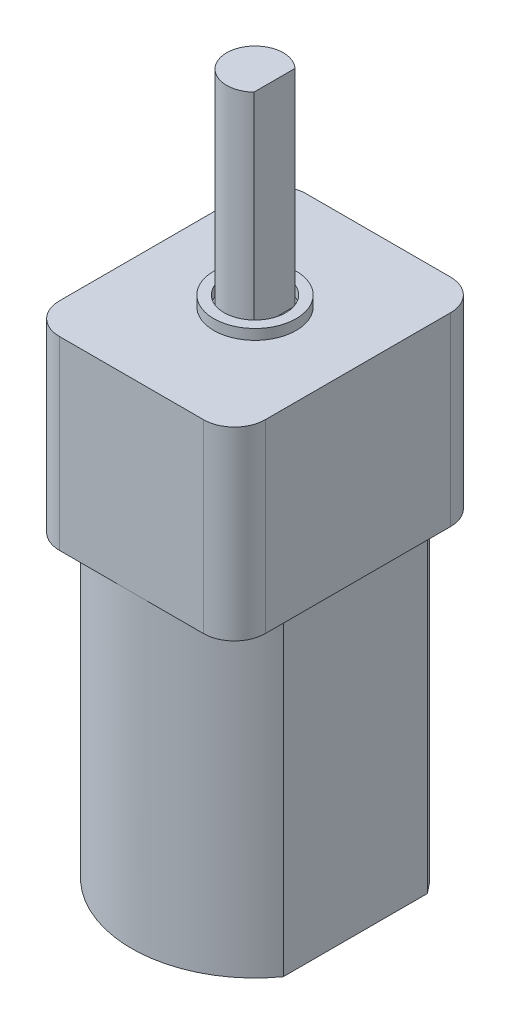
ISO-10303-21;
HEADER;
FILE_DESCRIPTION(('STEP AP214'),'2;1');
FILE_NAME('part.step','',(''),(''),'','','');
FILE_SCHEMA(('AUTOMOTIVE_DESIGN { 1 0 10303 214 1 1 1 1 }'));
ENDSEC;
DATA;
#1=APPLICATION_CONTEXT('core data for automotive mechanical design processes');
#2=APPLICATION_PROTOCOL_DEFINITION('international standard','automotive_design',2000,#1);
#3=PRODUCT_CONTEXT('',#1,'mechanical');
#4=PRODUCT('Part','Part','',(#3));
#5=PRODUCT_RELATED_PRODUCT_CATEGORY('part','',(#4));
#6=PRODUCT_DEFINITION_FORMATION('','',#4);
#7=PRODUCT_DEFINITION_CONTEXT('part definition',#1,'design');
#8=PRODUCT_DEFINITION('design','',#6,#7);
#9=PRODUCT_DEFINITION_SHAPE('','',#8);
#10=(LENGTH_UNIT() NAMED_UNIT(*) SI_UNIT(.MILLI.,.METRE.));
#11=(NAMED_UNIT(*) PLANE_ANGLE_UNIT() SI_UNIT($,.RADIAN.));
#12=(NAMED_UNIT(*) SI_UNIT($,.STERADIAN.) SOLID_ANGLE_UNIT());
#13=UNCERTAINTY_MEASURE_WITH_UNIT(LENGTH_MEASURE(1.E-05),#10,'distance_accuracy_value','');
#14=(GEOMETRIC_REPRESENTATION_CONTEXT(3) GLOBAL_UNCERTAINTY_ASSIGNED_CONTEXT((#13)) GLOBAL_UNIT_ASSIGNED_CONTEXT((#10,
#11,#12)) REPRESENTATION_CONTEXT('',''));
#15=CARTESIAN_POINT('',(0.,0.,0.));
#16=DIRECTION('',(0.,0.,1.));
#17=DIRECTION('',(1.,0.,0.));
#18=AXIS2_PLACEMENT_3D('',#15,#16,#17);
#19=CARTESIAN_POINT('',(0.,24.,0.));
#20=DIRECTION('',(0.,1.,0.));
#21=DIRECTION('',(0.,0.,1.));
#22=AXIS2_PLACEMENT_3D('',#19,#20,#21);
#23=PLANE('',#22);
#24=CARTESIAN_POINT('',(0.,24.,0.));
#25=DIRECTION('',(0.,1.,0.));
#26=DIRECTION('',(0.,0.,1.));
#27=AXIS2_PLACEMENT_3D('',#24,#25,#26);
#28=CIRCLE('',#27,1.5);
#29=CARTESIAN_POINT('',(0.,24.,1.5));
#30=VERTEX_POINT('',#29);
#31=EDGE_CURVE('E45',#30,#30,#28,.F.);
#32=ORIENTED_EDGE('',*,*,#31,.F.);
#33=EDGE_LOOP('',(#32));
#34=FACE_BOUND('',#33,.T.);
#35=DIRECTION('',(0.,0.,-1.));
#36=VECTOR('',#35,1.);
#37=CARTESIAN_POINT('',(0.943729304408844,24.,-1.));
#38=LINE('',#37,#36);
#39=CARTESIAN_POINT('',(0.943729304408844,24.,1.));
#40=VERTEX_POINT('',#39);
#41=CARTESIAN_POINT('',(0.943729304408844,24.,-1.));
#42=VERTEX_POINT('',#41);
#43=EDGE_CURVE('E165',#40,#42,#38,.T.);
#44=ORIENTED_EDGE('',*,*,#43,.F.);
#45=CARTESIAN_POINT('',(0.,24.,0.));
#46=DIRECTION('',(0.,1.,0.));
#47=DIRECTION('',(0.,0.,1.));
#48=AXIS2_PLACEMENT_3D('',#45,#46,#47);
#49=CIRCLE('',#48,1.375);
#50=EDGE_CURVE('E58',#42,#40,#49,.T.);
#51=ORIENTED_EDGE('',*,*,#50,.F.);
#52=EDGE_LOOP('',(#44,#51));
#53=FACE_BOUND('',#52,.T.);
#54=ADVANCED_FACE('F41',(#34,#53),#23,.T.);
#55=CARTESIAN_POINT('',(0.,15.,0.));
#56=DIRECTION('',(0.,-1.,0.));
#57=DIRECTION('',(0.,0.,-1.));
#58=AXIS2_PLACEMENT_3D('',#55,#56,#57);
#59=CYLINDRICAL_SURFACE('',#58,6.);
#60=CARTESIAN_POINT('',(0.,0.,0.));
#61=DIRECTION('',(0.,1.,0.));
#62=DIRECTION('',(0.,0.,1.));
#63=AXIS2_PLACEMENT_3D('',#60,#61,#62);
#64=CIRCLE('',#63,6.);
#65=CARTESIAN_POINT('',(-4.87339717240448,0.,3.5));
#66=VERTEX_POINT('',#65);
#67=CARTESIAN_POINT('',(4.87339717240448,0.,3.5));
#68=VERTEX_POINT('',#67);
#69=EDGE_CURVE('E204',#66,#68,#64,.T.);
#70=ORIENTED_EDGE('',*,*,#69,.T.);
#71=DIRECTION('',(0.,-1.,0.));
#72=VECTOR('',#71,1.);
#73=CARTESIAN_POINT('',(4.87339717240448,15.,3.5));
#74=LINE('',#73,#72);
#75=CARTESIAN_POINT('',(4.87339717240448,15.,3.5));
#76=VERTEX_POINT('',#75);
#77=EDGE_CURVE('E260',#76,#68,#74,.T.);
#78=ORIENTED_EDGE('',*,*,#77,.F.);
#79=CARTESIAN_POINT('',(0.,15.,0.));
#80=DIRECTION('',(0.,1.,0.));
#81=DIRECTION('',(0.,0.,1.));
#82=AXIS2_PLACEMENT_3D('',#79,#80,#81);
#83=CIRCLE('',#82,6.);
#84=CARTESIAN_POINT('',(0.,15.,6.));
#85=VERTEX_POINT('',#84);
#86=EDGE_CURVE('E223',#85,#76,#83,.T.);
#87=ORIENTED_EDGE('',*,*,#86,.F.);
#88=CARTESIAN_POINT('',(-4.87339717240448,15.,3.5));
#89=VERTEX_POINT('',#88);
#90=EDGE_CURVE('E218',#89,#85,#83,.T.);
#91=ORIENTED_EDGE('',*,*,#90,.F.);
#92=DIRECTION('',(0.,-1.,0.));
#93=VECTOR('',#92,1.);
#94=CARTESIAN_POINT('',(-4.87339717240448,15.,3.5));
#95=LINE('',#94,#93);
#96=EDGE_CURVE('E236',#89,#66,#95,.T.);
#97=ORIENTED_EDGE('',*,*,#96,.T.);
#98=EDGE_LOOP('',(#70,#78,#87,#91,#97));
#99=FACE_BOUND('',#98,.T.);
#100=ADVANCED_FACE('F323',(#99),#59,.T.);
#101=CARTESIAN_POINT('',(4.87339717240448,15.,3.5));
#102=DIRECTION('',(-1.,0.,0.));
#103=DIRECTION('',(0.,0.,1.));
#104=AXIS2_PLACEMENT_3D('',#101,#102,#103);
#105=PLANE('',#104);
#106=DIRECTION('',(0.,0.,-1.));
#107=VECTOR('',#106,1.);
#108=CARTESIAN_POINT('',(4.87339717240448,0.,3.5));
#109=LINE('',#108,#107);
#110=CARTESIAN_POINT('',(4.87339717240448,0.,-3.5));
#111=VERTEX_POINT('',#110);
#112=EDGE_CURVE('E240',#68,#111,#109,.T.);
#113=ORIENTED_EDGE('',*,*,#112,.T.);
#114=DIRECTION('',(0.,-1.,0.));
#115=VECTOR('',#114,1.);
#116=CARTESIAN_POINT('',(4.87339717240448,15.,-3.5));
#117=LINE('',#116,#115);
#118=CARTESIAN_POINT('',(4.87339717240448,15.,-3.5));
#119=VERTEX_POINT('',#118);
#120=EDGE_CURVE('E256',#119,#111,#117,.T.);
#121=ORIENTED_EDGE('',*,*,#120,.F.);
#122=DIRECTION('',(0.,0.,-1.));
#123=VECTOR('',#122,1.);
#124=CARTESIAN_POINT('',(4.87339717240448,15.,3.5));
#125=LINE('',#124,#123);
#126=EDGE_CURVE('E222',#76,#119,#125,.T.);
#127=ORIENTED_EDGE('',*,*,#126,.F.);
#128=ORIENTED_EDGE('',*,*,#77,.T.);
#129=EDGE_LOOP('',(#113,#121,#127,#128));
#130=FACE_BOUND('',#129,.T.);
#131=ADVANCED_FACE('F469',(#130),#105,.F.);
#132=CARTESIAN_POINT('',(0.,15.,0.));
#133=DIRECTION('',(0.,-1.,0.));
#134=DIRECTION('',(0.,0.,-1.));
#135=AXIS2_PLACEMENT_3D('',#132,#133,#134);
#136=CYLINDRICAL_SURFACE('',#135,6.);
#137=CARTESIAN_POINT('',(0.,0.,0.));
#138=DIRECTION('',(0.,1.,0.));
#139=DIRECTION('',(0.,0.,1.));
#140=AXIS2_PLACEMENT_3D('',#137,#138,#139);
#141=CIRCLE('',#140,6.);
#142=CARTESIAN_POINT('',(-4.87339717240448,0.,-3.5));
#143=VERTEX_POINT('',#142);
#144=EDGE_CURVE('E243',#111,#143,#141,.T.);
#145=ORIENTED_EDGE('',*,*,#144,.T.);
#146=DIRECTION('',(0.,-1.,0.));
#147=VECTOR('',#146,1.);
#148=CARTESIAN_POINT('',(-4.87339717240448,15.,-3.5));
#149=LINE('',#148,#147);
#150=CARTESIAN_POINT('',(-4.87339717240448,15.,-3.5));
#151=VERTEX_POINT('',#150);
#152=EDGE_CURVE('E252',#151,#143,#149,.T.);
#153=ORIENTED_EDGE('',*,*,#152,.F.);
#154=CARTESIAN_POINT('',(0.,15.,0.));
#155=DIRECTION('',(0.,1.,0.));
#156=DIRECTION('',(0.,0.,1.));
#157=AXIS2_PLACEMENT_3D('',#154,#155,#156);
#158=CIRCLE('',#157,6.);
#159=CARTESIAN_POINT('',(0.,15.,-6.));
#160=VERTEX_POINT('',#159);
#161=EDGE_CURVE('E227',#160,#151,#158,.T.);
#162=ORIENTED_EDGE('',*,*,#161,.F.);
#163=EDGE_CURVE('E228',#119,#160,#158,.T.);
#164=ORIENTED_EDGE('',*,*,#163,.F.);
#165=ORIENTED_EDGE('',*,*,#120,.T.);
#166=EDGE_LOOP('',(#145,#153,#162,#164,#165));
#167=FACE_BOUND('',#166,.T.);
#168=ADVANCED_FACE('F467',(#167),#136,.T.);
#169=CARTESIAN_POINT('',(-4.87339717240448,15.,3.5));
#170=DIRECTION('',(1.,0.,0.));
#171=DIRECTION('',(0.,0.,-1.));
#172=AXIS2_PLACEMENT_3D('',#169,#170,#171);
#173=PLANE('',#172);
#174=DIRECTION('',(0.,0.,1.));
#175=VECTOR('',#174,1.);
#176=CARTESIAN_POINT('',(-4.87339717240448,0.,3.5));
#177=LINE('',#176,#175);
#178=EDGE_CURVE('E246',#143,#66,#177,.T.);
#179=ORIENTED_EDGE('',*,*,#178,.T.);
#180=ORIENTED_EDGE('',*,*,#96,.F.);
#181=DIRECTION('',(0.,0.,1.));
#182=VECTOR('',#181,1.);
#183=CARTESIAN_POINT('',(-4.87339717240448,15.,3.5));
#184=LINE('',#183,#182);
#185=EDGE_CURVE('E232',#151,#89,#184,.T.);
#186=ORIENTED_EDGE('',*,*,#185,.F.);
#187=ORIENTED_EDGE('',*,*,#152,.T.);
#188=EDGE_LOOP('',(#179,#180,#186,#187));
#189=FACE_BOUND('',#188,.T.);
#190=ADVANCED_FACE('F367',(#189),#173,.F.);
#191=CARTESIAN_POINT('',(0.,0.,0.));
#192=DIRECTION('',(0.,1.,0.));
#193=DIRECTION('',(0.,0.,1.));
#194=AXIS2_PLACEMENT_3D('',#191,#192,#193);
#195=PLANE('',#194);
#196=CARTESIAN_POINT('',(0.,0.,0.));
#197=DIRECTION('',(0.,-1.,0.));
#198=DIRECTION('',(0.,0.,-1.));
#199=AXIS2_PLACEMENT_3D('',#196,#197,#198);
#200=CIRCLE('',#199,2.5);
#201=CARTESIAN_POINT('',(0.,0.,-2.5));
#202=VERTEX_POINT('',#201);
#203=EDGE_CURVE('E11',#202,#202,#200,.T.);
#204=ORIENTED_EDGE('',*,*,#203,.F.);
#205=EDGE_LOOP('',(#204));
#206=FACE_BOUND('',#205,.T.);
#207=ORIENTED_EDGE('',*,*,#69,.F.);
#208=ORIENTED_EDGE('',*,*,#178,.F.);
#209=ORIENTED_EDGE('',*,*,#144,.F.);
#210=ORIENTED_EDGE('',*,*,#112,.F.);
#211=EDGE_LOOP('',(#207,#208,#209,#210));
#212=FACE_BOUND('',#211,.T.);
#213=ADVANCED_FACE('F363',(#206,#212),#195,.F.);
#214=CARTESIAN_POINT('',(0.,15.,0.));
#215=DIRECTION('',(0.,1.,0.));
#216=DIRECTION('',(0.,0.,1.));
#217=AXIS2_PLACEMENT_3D('',#214,#215,#216);
#218=PLANE('',#217);
#219=DIRECTION('',(1.,0.,0.));
#220=VECTOR('',#219,1.);
#221=CARTESIAN_POINT('',(-5.,15.,6.));
#222=LINE('',#221,#220);
#223=CARTESIAN_POINT('',(-3.5,15.,6.));
#224=VERTEX_POINT('',#223);
#225=EDGE_CURVE('E209',#224,#85,#222,.T.);
#226=ORIENTED_EDGE('',*,*,#225,.F.);
#227=CARTESIAN_POINT('',(-3.5,15.,4.5));
#228=DIRECTION('',(0.,1.,0.));
#229=DIRECTION('',(0.,0.,1.));
#230=AXIS2_PLACEMENT_3D('',#227,#228,#229);
#231=CIRCLE('',#230,1.5);
#232=CARTESIAN_POINT('',(-5.,15.,4.5));
#233=VERTEX_POINT('',#232);
#234=EDGE_CURVE('E274',#224,#233,#231,.F.);
#235=ORIENTED_EDGE('',*,*,#234,.T.);
#236=DIRECTION('',(0.,0.,1.));
#237=VECTOR('',#236,1.);
#238=CARTESIAN_POINT('',(-5.,15.,-6.));
#239=LINE('',#238,#237);
#240=CARTESIAN_POINT('',(-5.,15.,-4.5));
#241=VERTEX_POINT('',#240);
#242=EDGE_CURVE('E183',#241,#233,#239,.T.);
#243=ORIENTED_EDGE('',*,*,#242,.F.);
#244=CARTESIAN_POINT('',(-3.5,15.,-4.5));
#245=DIRECTION('',(0.,1.,0.));
#246=DIRECTION('',(0.,0.,1.));
#247=AXIS2_PLACEMENT_3D('',#244,#245,#246);
#248=CIRCLE('',#247,1.5);
#249=CARTESIAN_POINT('',(-3.5,15.,-6.));
#250=VERTEX_POINT('',#249);
#251=EDGE_CURVE('E271',#241,#250,#248,.F.);
#252=ORIENTED_EDGE('',*,*,#251,.T.);
#253=DIRECTION('',(-1.,0.,0.));
#254=VECTOR('',#253,1.);
#255=CARTESIAN_POINT('',(-5.,15.,-6.));
#256=LINE('',#255,#254);
#257=EDGE_CURVE('E215',#160,#250,#256,.T.);
#258=ORIENTED_EDGE('',*,*,#257,.F.);
#259=ORIENTED_EDGE('',*,*,#161,.T.);
#260=ORIENTED_EDGE('',*,*,#185,.T.);
#261=ORIENTED_EDGE('',*,*,#90,.T.);
#262=EDGE_LOOP('',(#226,#235,#243,#252,#258,#259,#260,#261));
#263=FACE_BOUND('',#262,.T.);
#264=ADVANCED_FACE('F366',(#263),#218,.F.);
#265=DIRECTION('',(0.,0.,-1.));
#266=VECTOR('',#265,1.);
#267=CARTESIAN_POINT('',(5.,15.,-6.));
#268=LINE('',#267,#266);
#269=CARTESIAN_POINT('',(5.,15.,4.5));
#270=VERTEX_POINT('',#269);
#271=CARTESIAN_POINT('',(5.,15.,-4.5));
#272=VERTEX_POINT('',#271);
#273=EDGE_CURVE('E212',#270,#272,#268,.T.);
#274=ORIENTED_EDGE('',*,*,#273,.F.);
#275=CARTESIAN_POINT('',(3.5,15.,4.5));
#276=DIRECTION('',(0.,1.,0.));
#277=DIRECTION('',(0.,0.,1.));
#278=AXIS2_PLACEMENT_3D('',#275,#276,#277);
#279=CIRCLE('',#278,1.5);
#280=CARTESIAN_POINT('',(3.5,15.,6.));
#281=VERTEX_POINT('',#280);
#282=EDGE_CURVE('E311',#270,#281,#279,.F.);
#283=ORIENTED_EDGE('',*,*,#282,.T.);
#284=EDGE_CURVE('E208',#85,#281,#222,.T.);
#285=ORIENTED_EDGE('',*,*,#284,.F.);
#286=ORIENTED_EDGE('',*,*,#86,.T.);
#287=ORIENTED_EDGE('',*,*,#126,.T.);
#288=ORIENTED_EDGE('',*,*,#163,.T.);
#289=CARTESIAN_POINT('',(3.5,15.,-6.));
#290=VERTEX_POINT('',#289);
#291=EDGE_CURVE('E192',#290,#160,#256,.T.);
#292=ORIENTED_EDGE('',*,*,#291,.F.);
#293=CARTESIAN_POINT('',(3.5,15.,-4.5));
#294=DIRECTION('',(0.,1.,0.));
#295=DIRECTION('',(0.,0.,1.));
#296=AXIS2_PLACEMENT_3D('',#293,#294,#295);
#297=CIRCLE('',#296,1.5);
#298=EDGE_CURVE('E66',#290,#272,#297,.F.);
#299=ORIENTED_EDGE('',*,*,#298,.T.);
#300=EDGE_LOOP('',(#274,#283,#285,#286,#287,#288,#292,#299));
#301=FACE_BOUND('',#300,.T.);
#302=ADVANCED_FACE('F456',(#301),#218,.F.);
#303=CARTESIAN_POINT('',(-5.,24.,-6.));
#304=DIRECTION('',(1.,0.,0.));
#305=DIRECTION('',(0.,0.,-1.));
#306=AXIS2_PLACEMENT_3D('',#303,#304,#305);
#307=PLANE('',#306);
#308=ORIENTED_EDGE('',*,*,#242,.T.);
#309=DIRECTION('',(0.,-1.,0.));
#310=VECTOR('',#309,1.);
#311=CARTESIAN_POINT('',(-5.,24.,4.5));
#312=LINE('',#311,#310);
#313=CARTESIAN_POINT('',(-5.,24.,4.5));
#314=VERTEX_POINT('',#313);
#315=EDGE_CURVE('E281',#233,#314,#312,.F.);
#316=ORIENTED_EDGE('',*,*,#315,.T.);
#317=DIRECTION('',(0.,0.,1.));
#318=VECTOR('',#317,1.);
#319=CARTESIAN_POINT('',(-5.,24.,-6.));
#320=LINE('',#319,#318);
#321=CARTESIAN_POINT('',(-5.,24.,-4.5));
#322=VERTEX_POINT('',#321);
#323=EDGE_CURVE('E187',#322,#314,#320,.T.);
#324=ORIENTED_EDGE('',*,*,#323,.F.);
#325=DIRECTION('',(0.,-1.,0.));
#326=VECTOR('',#325,1.);
#327=CARTESIAN_POINT('',(-5.,24.,-4.5));
#328=LINE('',#327,#326);
#329=EDGE_CURVE('E277',#322,#241,#328,.T.);
#330=ORIENTED_EDGE('',*,*,#329,.T.);
#331=EDGE_LOOP('',(#308,#316,#324,#330));
#332=FACE_BOUND('',#331,.T.);
#333=ADVANCED_FACE('F418',(#332),#307,.F.);
#334=CARTESIAN_POINT('',(-5.,24.,6.));
#335=DIRECTION('',(0.,0.,-1.));
#336=DIRECTION('',(-1.,0.,0.));
#337=AXIS2_PLACEMENT_3D('',#334,#335,#336);
#338=PLANE('',#337);
#339=DIRECTION('',(1.,0.,0.));
#340=VECTOR('',#339,1.);
#341=CARTESIAN_POINT('',(-5.,24.,6.));
#342=LINE('',#341,#340);
#343=CARTESIAN_POINT('',(-3.5,24.,6.));
#344=VERTEX_POINT('',#343);
#345=CARTESIAN_POINT('',(3.5,24.,6.));
#346=VERTEX_POINT('',#345);
#347=EDGE_CURVE('E191',#344,#346,#342,.T.);
#348=ORIENTED_EDGE('',*,*,#347,.F.);
#349=DIRECTION('',(0.,-1.,0.));
#350=VECTOR('',#349,1.);
#351=CARTESIAN_POINT('',(-3.5,24.,6.));
#352=LINE('',#351,#350);
#353=EDGE_CURVE('E267',#344,#224,#352,.T.);
#354=ORIENTED_EDGE('',*,*,#353,.T.);
#355=ORIENTED_EDGE('',*,*,#225,.T.);
#356=ORIENTED_EDGE('',*,*,#284,.T.);
#357=DIRECTION('',(0.,-1.,0.));
#358=VECTOR('',#357,1.);
#359=CARTESIAN_POINT('',(3.5,24.,6.));
#360=LINE('',#359,#358);
#361=EDGE_CURVE('E264',#281,#346,#360,.F.);
#362=ORIENTED_EDGE('',*,*,#361,.T.);
#363=EDGE_LOOP('',(#348,#354,#355,#356,#362));
#364=FACE_BOUND('',#363,.T.);
#365=ADVANCED_FACE('F394',(#364),#338,.F.);
#366=CARTESIAN_POINT('',(5.,24.,-6.));
#367=DIRECTION('',(-1.,0.,0.));
#368=DIRECTION('',(0.,0.,1.));
#369=AXIS2_PLACEMENT_3D('',#366,#367,#368);
#370=PLANE('',#369);
#371=DIRECTION('',(0.,0.,-1.));
#372=VECTOR('',#371,1.);
#373=CARTESIAN_POINT('',(5.,24.,-6.));
#374=LINE('',#373,#372);
#375=CARTESIAN_POINT('',(5.,24.,4.5));
#376=VERTEX_POINT('',#375);
#377=CARTESIAN_POINT('',(5.,24.,-4.5));
#378=VERTEX_POINT('',#377);
#379=EDGE_CURVE('E196',#376,#378,#374,.T.);
#380=ORIENTED_EDGE('',*,*,#379,.F.);
#381=DIRECTION('',(0.,-1.,0.));
#382=VECTOR('',#381,1.);
#383=CARTESIAN_POINT('',(5.,24.,4.5));
#384=LINE('',#383,#382);
#385=EDGE_CURVE('E306',#376,#270,#384,.T.);
#386=ORIENTED_EDGE('',*,*,#385,.T.);
#387=ORIENTED_EDGE('',*,*,#273,.T.);
#388=DIRECTION('',(0.,-1.,0.));
#389=VECTOR('',#388,1.);
#390=CARTESIAN_POINT('',(5.,24.,-4.5));
#391=LINE('',#390,#389);
#392=EDGE_CURVE('E303',#272,#378,#391,.F.);
#393=ORIENTED_EDGE('',*,*,#392,.T.);
#394=EDGE_LOOP('',(#380,#386,#387,#393));
#395=FACE_BOUND('',#394,.T.);
#396=ADVANCED_FACE('F403',(#395),#370,.F.);
#397=CARTESIAN_POINT('',(-5.,24.,-6.));
#398=DIRECTION('',(0.,0.,1.));
#399=DIRECTION('',(1.,0.,0.));
#400=AXIS2_PLACEMENT_3D('',#397,#398,#399);
#401=PLANE('',#400);
#402=ORIENTED_EDGE('',*,*,#257,.T.);
#403=DIRECTION('',(0.,-1.,0.));
#404=VECTOR('',#403,1.);
#405=CARTESIAN_POINT('',(-3.5,24.,-6.));
#406=LINE('',#405,#404);
#407=CARTESIAN_POINT('',(-3.5,24.,-6.));
#408=VERTEX_POINT('',#407);
#409=EDGE_CURVE('E300',#250,#408,#406,.F.);
#410=ORIENTED_EDGE('',*,*,#409,.T.);
#411=DIRECTION('',(-1.,0.,0.));
#412=VECTOR('',#411,1.);
#413=CARTESIAN_POINT('',(-5.,24.,-6.));
#414=LINE('',#413,#412);
#415=CARTESIAN_POINT('',(3.5,24.,-6.));
#416=VERTEX_POINT('',#415);
#417=EDGE_CURVE('E200',#416,#408,#414,.T.);
#418=ORIENTED_EDGE('',*,*,#417,.F.);
#419=DIRECTION('',(0.,-1.,0.));
#420=VECTOR('',#419,1.);
#421=CARTESIAN_POINT('',(3.5,24.,-6.));
#422=LINE('',#421,#420);
#423=EDGE_CURVE('E296',#416,#290,#422,.T.);
#424=ORIENTED_EDGE('',*,*,#423,.T.);
#425=ORIENTED_EDGE('',*,*,#291,.T.);
#426=EDGE_LOOP('',(#402,#410,#418,#424,#425));
#427=FACE_BOUND('',#426,.T.);
#428=ADVANCED_FACE('F410',(#427),#401,.F.);
#429=CARTESIAN_POINT('',(0.,24.,0.));
#430=DIRECTION('',(0.,1.,0.));
#431=DIRECTION('',(0.,0.,1.));
#432=AXIS2_PLACEMENT_3D('',#429,#430,#431);
#433=CIRCLE('',#432,2.);
#434=CARTESIAN_POINT('',(0.,24.,2.));
#435=VERTEX_POINT('',#434);
#436=EDGE_CURVE('E174',#435,#435,#433,.T.);
#437=ORIENTED_EDGE('',*,*,#436,.F.);
#438=EDGE_LOOP('',(#437));
#439=FACE_BOUND('',#438,.T.);
#440=ORIENTED_EDGE('',*,*,#323,.T.);
#441=CARTESIAN_POINT('',(-3.5,24.,4.5));
#442=DIRECTION('',(0.,1.,0.));
#443=DIRECTION('',(0.,0.,1.));
#444=AXIS2_PLACEMENT_3D('',#441,#442,#443);
#445=CIRCLE('',#444,1.5);
#446=EDGE_CURVE('E293',#314,#344,#445,.T.);
#447=ORIENTED_EDGE('',*,*,#446,.T.);
#448=ORIENTED_EDGE('',*,*,#347,.T.);
#449=CARTESIAN_POINT('',(3.5,24.,4.5));
#450=DIRECTION('',(0.,1.,0.));
#451=DIRECTION('',(0.,0.,1.));
#452=AXIS2_PLACEMENT_3D('',#449,#450,#451);
#453=CIRCLE('',#452,1.5);
#454=EDGE_CURVE('E287',#346,#376,#453,.T.);
#455=ORIENTED_EDGE('',*,*,#454,.T.);
#456=ORIENTED_EDGE('',*,*,#379,.T.);
#457=CARTESIAN_POINT('',(3.5,24.,-4.5));
#458=DIRECTION('',(0.,1.,0.));
#459=DIRECTION('',(0.,0.,1.));
#460=AXIS2_PLACEMENT_3D('',#457,#458,#459);
#461=CIRCLE('',#460,1.5);
#462=EDGE_CURVE('E284',#378,#416,#461,.T.);
#463=ORIENTED_EDGE('',*,*,#462,.T.);
#464=ORIENTED_EDGE('',*,*,#417,.T.);
#465=CARTESIAN_POINT('',(-3.5,24.,-4.5));
#466=DIRECTION('',(0.,1.,0.));
#467=DIRECTION('',(0.,0.,1.));
#468=AXIS2_PLACEMENT_3D('',#465,#466,#467);
#469=CIRCLE('',#468,1.5);
#470=EDGE_CURVE('E290',#408,#322,#469,.T.);
#471=ORIENTED_EDGE('',*,*,#470,.T.);
#472=EDGE_LOOP('',(#440,#447,#448,#455,#456,#463,#464,#471));
#473=FACE_BOUND('',#472,.T.);
#474=ADVANCED_FACE('F325',(#439,#473),#23,.T.);
#475=CARTESIAN_POINT('',(-3.5,24.,4.5));
#476=DIRECTION('',(0.,-1.,0.));
#477=DIRECTION('',(0.,0.,-1.));
#478=AXIS2_PLACEMENT_3D('',#475,#476,#477);
#479=CYLINDRICAL_SURFACE('',#478,1.5);
#480=ORIENTED_EDGE('',*,*,#446,.F.);
#481=ORIENTED_EDGE('',*,*,#315,.F.);
#482=ORIENTED_EDGE('',*,*,#234,.F.);
#483=ORIENTED_EDGE('',*,*,#353,.F.);
#484=EDGE_LOOP('',(#480,#481,#482,#483));
#485=FACE_BOUND('',#484,.T.);
#486=ADVANCED_FACE('F422',(#485),#479,.T.);
#487=CARTESIAN_POINT('',(-3.5,24.,-4.5));
#488=DIRECTION('',(0.,-1.,0.));
#489=DIRECTION('',(0.,0.,-1.));
#490=AXIS2_PLACEMENT_3D('',#487,#488,#489);
#491=CYLINDRICAL_SURFACE('',#490,1.5);
#492=ORIENTED_EDGE('',*,*,#470,.F.);
#493=ORIENTED_EDGE('',*,*,#409,.F.);
#494=ORIENTED_EDGE('',*,*,#251,.F.);
#495=ORIENTED_EDGE('',*,*,#329,.F.);
#496=EDGE_LOOP('',(#492,#493,#494,#495));
#497=FACE_BOUND('',#496,.T.);
#498=ADVANCED_FACE('F413',(#497),#491,.T.);
#499=CARTESIAN_POINT('',(3.5,24.,4.5));
#500=DIRECTION('',(0.,-1.,0.));
#501=DIRECTION('',(0.,0.,-1.));
#502=AXIS2_PLACEMENT_3D('',#499,#500,#501);
#503=CYLINDRICAL_SURFACE('',#502,1.5);
#504=ORIENTED_EDGE('',*,*,#454,.F.);
#505=ORIENTED_EDGE('',*,*,#361,.F.);
#506=ORIENTED_EDGE('',*,*,#282,.F.);
#507=ORIENTED_EDGE('',*,*,#385,.F.);
#508=EDGE_LOOP('',(#504,#505,#506,#507));
#509=FACE_BOUND('',#508,.T.);
#510=ADVANCED_FACE('F397',(#509),#503,.T.);
#511=CARTESIAN_POINT('',(3.5,24.,-4.5));
#512=DIRECTION('',(0.,-1.,0.));
#513=DIRECTION('',(0.,0.,-1.));
#514=AXIS2_PLACEMENT_3D('',#511,#512,#513);
#515=CYLINDRICAL_SURFACE('',#514,1.5);
#516=ORIENTED_EDGE('',*,*,#462,.F.);
#517=ORIENTED_EDGE('',*,*,#392,.F.);
#518=ORIENTED_EDGE('',*,*,#298,.F.);
#519=ORIENTED_EDGE('',*,*,#423,.F.);
#520=EDGE_LOOP('',(#516,#517,#518,#519));
#521=FACE_BOUND('',#520,.T.);
#522=ADVANCED_FACE('F43',(#521),#515,.T.);
#523=CARTESIAN_POINT('',(0.,24.5,0.));
#524=DIRECTION('',(0.,1.,0.));
#525=DIRECTION('',(0.,0.,1.));
#526=AXIS2_PLACEMENT_3D('',#523,#524,#525);
#527=PLANE('',#526);
#528=CARTESIAN_POINT('',(0.,24.5,0.));
#529=DIRECTION('',(0.,1.,0.));
#530=DIRECTION('',(0.,0.,1.));
#531=AXIS2_PLACEMENT_3D('',#528,#529,#530);
#532=CIRCLE('',#531,2.);
#533=CARTESIAN_POINT('',(0.,24.5,2.));
#534=VERTEX_POINT('',#533);
#535=EDGE_CURVE('E179',#534,#534,#532,.T.);
#536=ORIENTED_EDGE('',*,*,#535,.T.);
#537=EDGE_LOOP('',(#536));
#538=FACE_BOUND('',#537,.T.);
#539=CARTESIAN_POINT('',(0.,24.5,0.));
#540=DIRECTION('',(0.,1.,0.));
#541=DIRECTION('',(0.,0.,1.));
#542=AXIS2_PLACEMENT_3D('',#539,#540,#541);
#543=CIRCLE('',#542,1.5);
#544=CARTESIAN_POINT('',(0.,24.5,1.5));
#545=VERTEX_POINT('',#544);
#546=EDGE_CURVE('E169',#545,#545,#543,.T.);
#547=ORIENTED_EDGE('',*,*,#546,.F.);
#548=EDGE_LOOP('',(#547));
#549=FACE_BOUND('',#548,.T.);
#550=ADVANCED_FACE('F438',(#538,#549),#527,.T.);
#551=CARTESIAN_POINT('',(0.,24.5,0.));
#552=DIRECTION('',(0.,-1.,0.));
#553=DIRECTION('',(0.,0.,-1.));
#554=AXIS2_PLACEMENT_3D('',#551,#552,#553);
#555=CYLINDRICAL_SURFACE('',#554,2.);
#556=ORIENTED_EDGE('',*,*,#535,.F.);
#557=EDGE_LOOP('',(#556));
#558=FACE_BOUND('',#557,.T.);
#559=ORIENTED_EDGE('',*,*,#436,.T.);
#560=EDGE_LOOP('',(#559));
#561=FACE_BOUND('',#560,.T.);
#562=ADVANCED_FACE('F442',(#558,#561),#555,.T.);
#563=CARTESIAN_POINT('',(0.,24.5,0.));
#564=DIRECTION('',(0.,-1.,0.));
#565=DIRECTION('',(0.,0.,-1.));
#566=AXIS2_PLACEMENT_3D('',#563,#564,#565);
#567=CYLINDRICAL_SURFACE('',#566,1.5);
#568=ORIENTED_EDGE('',*,*,#546,.T.);
#569=EDGE_LOOP('',(#568));
#570=FACE_BOUND('',#569,.T.);
#571=ORIENTED_EDGE('',*,*,#31,.T.);
#572=EDGE_LOOP('',(#571));
#573=FACE_BOUND('',#572,.T.);
#574=ADVANCED_FACE('F319',(#570,#573),#567,.F.);
#575=CARTESIAN_POINT('',(0.,34.,0.));
#576=DIRECTION('',(0.,-1.,0.));
#577=DIRECTION('',(0.,0.,-1.));
#578=AXIS2_PLACEMENT_3D('',#575,#576,#577);
#579=CYLINDRICAL_SURFACE('',#578,1.375);
#580=ORIENTED_EDGE('',*,*,#50,.T.);
#581=DIRECTION('',(0.,-1.,0.));
#582=VECTOR('',#581,1.);
#583=CARTESIAN_POINT('',(0.943729304408844,34.,1.));
#584=LINE('',#583,#582);
#585=CARTESIAN_POINT('',(0.943729304408844,34.,1.));
#586=VERTEX_POINT('',#585);
#587=EDGE_CURVE('E155',#586,#40,#584,.T.);
#588=ORIENTED_EDGE('',*,*,#587,.F.);
#589=CARTESIAN_POINT('',(0.,34.,0.));
#590=DIRECTION('',(0.,1.,0.));
#591=DIRECTION('',(0.,0.,1.));
#592=AXIS2_PLACEMENT_3D('',#589,#590,#591);
#593=CIRCLE('',#592,1.375);
#594=CARTESIAN_POINT('',(0.943729304408844,34.,-1.));
#595=VERTEX_POINT('',#594);
#596=EDGE_CURVE('E161',#595,#586,#593,.T.);
#597=ORIENTED_EDGE('',*,*,#596,.F.);
#598=DIRECTION('',(0.,-1.,0.));
#599=VECTOR('',#598,1.);
#600=CARTESIAN_POINT('',(0.943729304408844,34.,-1.));
#601=LINE('',#600,#599);
#602=EDGE_CURVE('E157',#595,#42,#601,.T.);
#603=ORIENTED_EDGE('',*,*,#602,.T.);
#604=EDGE_LOOP('',(#580,#588,#597,#603));
#605=FACE_BOUND('',#604,.T.);
#606=ADVANCED_FACE('F167',(#605),#579,.T.);
#607=CARTESIAN_POINT('',(0.943729304408844,34.,-1.));
#608=DIRECTION('',(-1.,0.,0.));
#609=DIRECTION('',(0.,0.,1.));
#610=AXIS2_PLACEMENT_3D('',#607,#608,#609);
#611=PLANE('',#610);
#612=ORIENTED_EDGE('',*,*,#43,.T.);
#613=ORIENTED_EDGE('',*,*,#602,.F.);
#614=DIRECTION('',(0.,0.,-1.));
#615=VECTOR('',#614,1.);
#616=CARTESIAN_POINT('',(0.943729304408844,34.,-1.));
#617=LINE('',#616,#615);
#618=EDGE_CURVE('E152',#586,#595,#617,.T.);
#619=ORIENTED_EDGE('',*,*,#618,.F.);
#620=ORIENTED_EDGE('',*,*,#587,.T.);
#621=EDGE_LOOP('',(#612,#613,#619,#620));
#622=FACE_BOUND('',#621,.T.);
#623=ADVANCED_FACE('F154',(#622),#611,.F.);
#624=CARTESIAN_POINT('',(0.,34.,0.));
#625=DIRECTION('',(0.,1.,0.));
#626=DIRECTION('',(0.,0.,1.));
#627=AXIS2_PLACEMENT_3D('',#624,#625,#626);
#628=PLANE('',#627);
#629=ORIENTED_EDGE('',*,*,#596,.T.);
#630=ORIENTED_EDGE('',*,*,#618,.T.);
#631=EDGE_LOOP('',(#629,#630));
#632=FACE_BOUND('',#631,.T.);
#633=ADVANCED_FACE('F163',(#632),#628,.T.);
#634=CARTESIAN_POINT('',(0.,-1.5,0.));
#635=DIRECTION('',(0.,1.,0.));
#636=DIRECTION('',(0.,0.,1.));
#637=AXIS2_PLACEMENT_3D('',#634,#635,#636);
#638=CYLINDRICAL_SURFACE('',#637,2.5);
#639=CARTESIAN_POINT('',(0.,-1.5,0.));
#640=DIRECTION('',(0.,-1.,0.));
#641=DIRECTION('',(0.,0.,-1.));
#642=AXIS2_PLACEMENT_3D('',#639,#640,#641);
#643=CIRCLE('',#642,2.5);
#644=CARTESIAN_POINT('',(0.,-1.5,-2.5));
#645=VERTEX_POINT('',#644);
#646=EDGE_CURVE('E328',#645,#645,#643,.T.);
#647=ORIENTED_EDGE('',*,*,#646,.F.);
#648=EDGE_LOOP('',(#647));
#649=FACE_BOUND('',#648,.T.);
#650=ORIENTED_EDGE('',*,*,#203,.T.);
#651=EDGE_LOOP('',(#650));
#652=FACE_BOUND('',#651,.T.);
#653=ADVANCED_FACE('F354',(#649,#652),#638,.T.);
#654=CARTESIAN_POINT('',(0.,-1.5,0.));
#655=DIRECTION('',(0.,-1.,0.));
#656=DIRECTION('',(0.,0.,-1.));
#657=AXIS2_PLACEMENT_3D('',#654,#655,#656);
#658=PLANE('',#657);
#659=CARTESIAN_POINT('',(0.,-1.5,0.));
#660=DIRECTION('',(0.,-1.,0.));
#661=DIRECTION('',(0.,0.,-1.));
#662=AXIS2_PLACEMENT_3D('',#659,#660,#661);
#663=CIRCLE('',#662,0.75);
#664=CARTESIAN_POINT('',(0.,-1.5,-0.75));
#665=VERTEX_POINT('',#664);
#666=EDGE_CURVE('E335',#665,#665,#663,.T.);
#667=ORIENTED_EDGE('',*,*,#666,.F.);
#668=EDGE_LOOP('',(#667));
#669=FACE_BOUND('',#668,.T.);
#670=ORIENTED_EDGE('',*,*,#646,.T.);
#671=EDGE_LOOP('',(#670));
#672=FACE_BOUND('',#671,.T.);
#673=ADVANCED_FACE('F348',(#669,#672),#658,.T.);
#674=CARTESIAN_POINT('',(0.,-1.,0.));
#675=DIRECTION('',(0.,-1.,0.));
#676=DIRECTION('',(0.,0.,-1.));
#677=AXIS2_PLACEMENT_3D('',#674,#675,#676);
#678=CYLINDRICAL_SURFACE('',#677,0.75);
#679=CARTESIAN_POINT('',(0.,-1.,0.));
#680=DIRECTION('',(0.,-1.,0.));
#681=DIRECTION('',(0.,0.,-1.));
#682=AXIS2_PLACEMENT_3D('',#679,#680,#681);
#683=CIRCLE('',#682,0.75);
#684=CARTESIAN_POINT('',(0.,-1.,-0.75));
#685=VERTEX_POINT('',#684);
#686=EDGE_CURVE('E334',#685,#685,#683,.T.);
#687=ORIENTED_EDGE('',*,*,#686,.F.);
#688=EDGE_LOOP('',(#687));
#689=FACE_BOUND('',#688,.T.);
#690=ORIENTED_EDGE('',*,*,#666,.T.);
#691=EDGE_LOOP('',(#690));
#692=FACE_BOUND('',#691,.T.);
#693=ADVANCED_FACE('F345',(#689,#692),#678,.F.);
#694=CARTESIAN_POINT('',(0.,-1.,0.));
#695=DIRECTION('',(0.,-1.,0.));
#696=DIRECTION('',(0.,0.,-1.));
#697=AXIS2_PLACEMENT_3D('',#694,#695,#696);
#698=PLANE('',#697);
#699=ORIENTED_EDGE('',*,*,#686,.T.);
#700=EDGE_LOOP('',(#699));
#701=FACE_BOUND('',#700,.T.);
#702=ADVANCED_FACE('F343',(#701),#698,.T.);
#703=CLOSED_SHELL('',(#54,#100,#131,#168,#190,#213,#264,#302,#333,#365,#396,#428,#474,#486,#498,
#510,#522,#550,#562,#574,#606,#623,#633,#653,#673,#693,#702));
#704=MANIFOLD_SOLID_BREP('B2',#703);
#705=ADVANCED_BREP_SHAPE_REPRESENTATION('',(#18,#704),#14);
#706=SHAPE_DEFINITION_REPRESENTATION(#9,#705);
ENDSEC;
END-ISO-10303-21;
